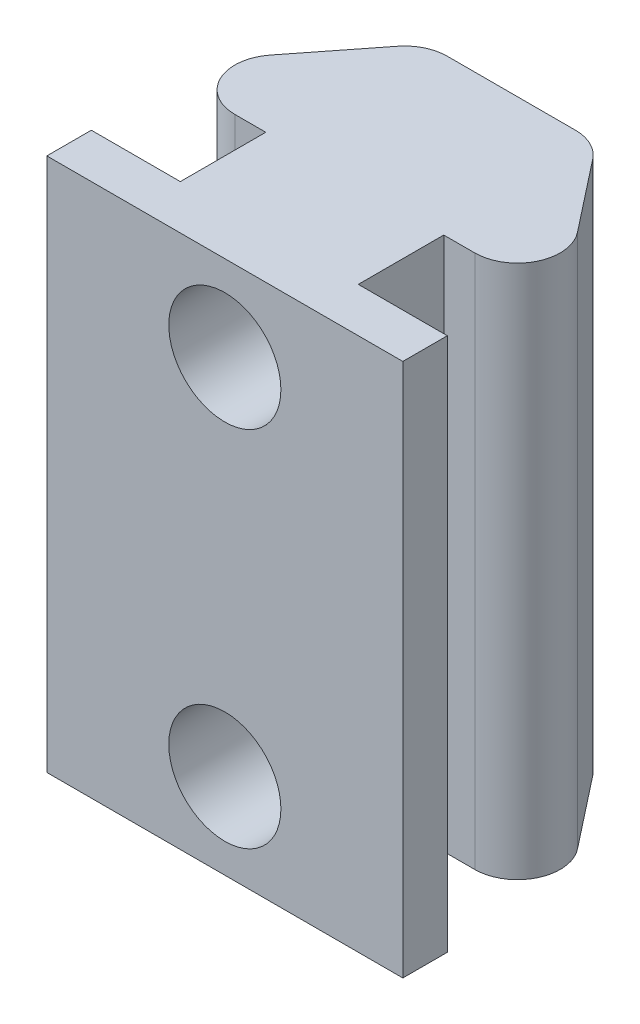
ISO-10303-21;
HEADER;
FILE_DESCRIPTION(('STEP AP214'),'2;1');
FILE_NAME('part.step','',(''),(''),'','','');
FILE_SCHEMA(('AUTOMOTIVE_DESIGN { 1 0 10303 214 1 1 1 1 }'));
ENDSEC;
DATA;
#1=APPLICATION_CONTEXT('core data for automotive mechanical design processes');
#2=APPLICATION_PROTOCOL_DEFINITION('international standard','automotive_design',2000,#1);
#3=PRODUCT_CONTEXT('',#1,'mechanical');
#4=PRODUCT('Part','Part','',(#3));
#5=PRODUCT_RELATED_PRODUCT_CATEGORY('part','',(#4));
#6=PRODUCT_DEFINITION_FORMATION('','',#4);
#7=PRODUCT_DEFINITION_CONTEXT('part definition',#1,'design');
#8=PRODUCT_DEFINITION('design','',#6,#7);
#9=PRODUCT_DEFINITION_SHAPE('','',#8);
#10=(LENGTH_UNIT() NAMED_UNIT(*) SI_UNIT(.MILLI.,.METRE.));
#11=(NAMED_UNIT(*) PLANE_ANGLE_UNIT() SI_UNIT($,.RADIAN.));
#12=(NAMED_UNIT(*) SI_UNIT($,.STERADIAN.) SOLID_ANGLE_UNIT());
#13=UNCERTAINTY_MEASURE_WITH_UNIT(LENGTH_MEASURE(1.E-05),#10,'distance_accuracy_value','');
#14=(GEOMETRIC_REPRESENTATION_CONTEXT(3) GLOBAL_UNCERTAINTY_ASSIGNED_CONTEXT((#13)) GLOBAL_UNIT_ASSIGNED_CONTEXT((#10,
#11,#12)) REPRESENTATION_CONTEXT('',''));
#15=CARTESIAN_POINT('',(0.,0.,0.));
#16=DIRECTION('',(0.,0.,1.));
#17=DIRECTION('',(1.,0.,0.));
#18=AXIS2_PLACEMENT_3D('',#15,#16,#17);
#19=CARTESIAN_POINT('',(0.,0.,0.));
#20=DIRECTION('',(0.,0.,1.));
#21=DIRECTION('',(1.,0.,0.));
#22=AXIS2_PLACEMENT_3D('',#19,#20,#21);
#23=PLANE('',#22);
#24=DIRECTION('',(0.,1.,0.));
#25=VECTOR('',#24,1.);
#26=CARTESIAN_POINT('',(-3.175,-23.995460961654,0.));
#27=LINE('',#26,#25);
#28=CARTESIAN_POINT('',(-3.175,-9.525,0.));
#29=VERTEX_POINT('',#28);
#30=CARTESIAN_POINT('',(-3.175,9.525,0.));
#31=VERTEX_POINT('',#30);
#32=EDGE_CURVE('E64',#29,#31,#27,.T.);
#33=ORIENTED_EDGE('',*,*,#32,.F.);
#34=DIRECTION('',(1.,0.,0.));
#35=VECTOR('',#34,1.);
#36=CARTESIAN_POINT('',(-6.35,-9.525,0.));
#37=LINE('',#36,#35);
#38=CARTESIAN_POINT('',(-6.35,-9.525,0.));
#39=VERTEX_POINT('',#38);
#40=EDGE_CURVE('E251',#39,#29,#37,.T.);
#41=ORIENTED_EDGE('',*,*,#40,.F.);
#42=DIRECTION('',(0.,1.,0.));
#43=VECTOR('',#42,1.);
#44=CARTESIAN_POINT('',(-6.35,-9.525,0.));
#45=LINE('',#44,#43);
#46=CARTESIAN_POINT('',(-6.35,9.525,0.));
#47=VERTEX_POINT('',#46);
#48=EDGE_CURVE('E239',#39,#47,#45,.T.);
#49=ORIENTED_EDGE('',*,*,#48,.T.);
#50=DIRECTION('',(1.,0.,0.));
#51=VECTOR('',#50,1.);
#52=CARTESIAN_POINT('',(-6.35,9.525,0.));
#53=LINE('',#52,#51);
#54=EDGE_CURVE('E246',#47,#31,#53,.T.);
#55=ORIENTED_EDGE('',*,*,#54,.T.);
#56=EDGE_LOOP('',(#33,#41,#49,#55));
#57=FACE_BOUND('',#56,.T.);
#58=ADVANCED_FACE('F39',(#57),#23,.F.);
#59=CARTESIAN_POINT('',(-6.35,9.525,1.5875));
#60=DIRECTION('',(0.,1.,0.));
#61=DIRECTION('',(0.,0.,1.));
#62=AXIS2_PLACEMENT_3D('',#59,#60,#61);
#63=PLANE('',#62);
#64=ORIENTED_EDGE('',*,*,#54,.F.);
#65=DIRECTION('',(0.,0.,-1.));
#66=VECTOR('',#65,1.);
#67=CARTESIAN_POINT('',(-6.35,9.525,1.5875));
#68=LINE('',#67,#66);
#69=CARTESIAN_POINT('',(-6.35,9.525,1.5875));
#70=VERTEX_POINT('',#69);
#71=EDGE_CURVE('E11',#70,#47,#68,.T.);
#72=ORIENTED_EDGE('',*,*,#71,.F.);
#73=DIRECTION('',(1.,0.,0.));
#74=VECTOR('',#73,1.);
#75=CARTESIAN_POINT('',(-6.35,9.525,1.5875));
#76=LINE('',#75,#74);
#77=CARTESIAN_POINT('',(6.35,9.525,1.5875));
#78=VERTEX_POINT('',#77);
#79=EDGE_CURVE('E235',#70,#78,#76,.T.);
#80=ORIENTED_EDGE('',*,*,#79,.T.);
#81=DIRECTION('',(0.,0.,-1.));
#82=VECTOR('',#81,1.);
#83=CARTESIAN_POINT('',(6.35,9.525,1.5875));
#84=LINE('',#83,#82);
#85=CARTESIAN_POINT('',(6.35,9.525,0.));
#86=VERTEX_POINT('',#85);
#87=EDGE_CURVE('E43',#78,#86,#84,.T.);
#88=ORIENTED_EDGE('',*,*,#87,.T.);
#89=CARTESIAN_POINT('',(3.175,9.525,0.));
#90=VERTEX_POINT('',#89);
#91=EDGE_CURVE('E179',#90,#86,#53,.T.);
#92=ORIENTED_EDGE('',*,*,#91,.F.);
#93=DIRECTION('',(0.,0.,-1.));
#94=VECTOR('',#93,1.);
#95=CARTESIAN_POINT('',(3.175,9.525,0.));
#96=LINE('',#95,#94);
#97=CARTESIAN_POINT('',(3.175,9.525,-3.048));
#98=VERTEX_POINT('',#97);
#99=EDGE_CURVE('E160',#90,#98,#96,.T.);
#100=ORIENTED_EDGE('',*,*,#99,.T.);
#101=DIRECTION('',(1.,0.,0.));
#102=VECTOR('',#101,1.);
#103=CARTESIAN_POINT('',(3.175,9.525,-3.048));
#104=LINE('',#103,#102);
#105=CARTESIAN_POINT('',(4.28146605456342,9.525,-3.048));
#106=VERTEX_POINT('',#105);
#107=EDGE_CURVE('E168',#98,#106,#104,.T.);
#108=ORIENTED_EDGE('',*,*,#107,.T.);
#109=CARTESIAN_POINT('',(4.28146605456342,9.525,-4.572));
#110=DIRECTION('',(0.,1.,0.));
#111=DIRECTION('',(0.,0.,1.));
#112=AXIS2_PLACEMENT_3D('',#109,#110,#111);
#113=CIRCLE('',#112,1.524);
#114=CARTESIAN_POINT('',(5.47987209756336,9.525,-5.51348762928742));
#115=VERTEX_POINT('',#114);
#116=EDGE_CURVE('E174',#106,#115,#113,.T.);
#117=ORIENTED_EDGE('',*,*,#116,.T.);
#118=DIRECTION('',(-0.617774034965497,0.,-0.786355671259799));
#119=VECTOR('',#118,1.);
#120=CARTESIAN_POINT('',(5.47987209756336,9.525,-5.51348762928742));
#121=LINE('',#120,#119);
#122=CARTESIAN_POINT('',(3.48440604299993,9.525,-8.05348762928742));
#123=VERTEX_POINT('',#122);
#124=EDGE_CURVE('E190',#115,#123,#121,.T.);
#125=ORIENTED_EDGE('',*,*,#124,.T.);
#126=CARTESIAN_POINT('',(2.286,9.525,-7.112));
#127=DIRECTION('',(0.,1.,0.));
#128=DIRECTION('',(0.,0.,1.));
#129=AXIS2_PLACEMENT_3D('',#126,#127,#128);
#130=CIRCLE('',#129,1.524);
#131=CARTESIAN_POINT('',(2.286,9.525,-8.636));
#132=VERTEX_POINT('',#131);
#133=EDGE_CURVE('E193',#123,#132,#130,.T.);
#134=ORIENTED_EDGE('',*,*,#133,.T.);
#135=DIRECTION('',(-1.,0.,0.));
#136=VECTOR('',#135,1.);
#137=CARTESIAN_POINT('',(2.286,9.525,-8.636));
#138=LINE('',#137,#136);
#139=CARTESIAN_POINT('',(-2.286,9.525,-8.636));
#140=VERTEX_POINT('',#139);
#141=EDGE_CURVE('E196',#132,#140,#138,.T.);
#142=ORIENTED_EDGE('',*,*,#141,.T.);
#143=CARTESIAN_POINT('',(-2.286,9.525,-7.112));
#144=DIRECTION('',(0.,1.,0.));
#145=DIRECTION('',(0.,0.,-1.));
#146=AXIS2_PLACEMENT_3D('',#143,#144,#145);
#147=CIRCLE('',#146,1.524);
#148=CARTESIAN_POINT('',(-3.48440604299993,9.525,-8.05348762928742));
#149=VERTEX_POINT('',#148);
#150=EDGE_CURVE('E199',#140,#149,#147,.T.);
#151=ORIENTED_EDGE('',*,*,#150,.T.);
#152=DIRECTION('',(-0.617774034965497,0.,0.786355671259799));
#153=VECTOR('',#152,1.);
#154=CARTESIAN_POINT('',(-5.47987209756336,9.525,-5.51348762928742));
#155=LINE('',#154,#153);
#156=CARTESIAN_POINT('',(-5.47987209756336,9.525,-5.51348762928742));
#157=VERTEX_POINT('',#156);
#158=EDGE_CURVE('E202',#149,#157,#155,.T.);
#159=ORIENTED_EDGE('',*,*,#158,.T.);
#160=CARTESIAN_POINT('',(-4.28146605456342,9.525,-4.572));
#161=DIRECTION('',(0.,1.,0.));
#162=DIRECTION('',(0.,0.,-1.));
#163=AXIS2_PLACEMENT_3D('',#160,#161,#162);
#164=CIRCLE('',#163,1.524);
#165=CARTESIAN_POINT('',(-4.28146605456342,9.525,-3.048));
#166=VERTEX_POINT('',#165);
#167=EDGE_CURVE('E205',#157,#166,#164,.T.);
#168=ORIENTED_EDGE('',*,*,#167,.T.);
#169=DIRECTION('',(1.,0.,0.));
#170=VECTOR('',#169,1.);
#171=CARTESIAN_POINT('',(-3.175,9.525,-3.048));
#172=LINE('',#171,#170);
#173=CARTESIAN_POINT('',(-3.175,9.525,-3.048));
#174=VERTEX_POINT('',#173);
#175=EDGE_CURVE('E208',#166,#174,#172,.T.);
#176=ORIENTED_EDGE('',*,*,#175,.T.);
#177=DIRECTION('',(0.,0.,1.));
#178=VECTOR('',#177,1.);
#179=CARTESIAN_POINT('',(-3.175,9.525,0.));
#180=LINE('',#179,#178);
#181=EDGE_CURVE('E211',#174,#31,#180,.T.);
#182=ORIENTED_EDGE('',*,*,#181,.T.);
#183=EDGE_LOOP('',(#64,#72,#80,#88,#92,#100,#108,#117,#125,#134,#142,#151,#159,#168,#176,#182));
#184=FACE_BOUND('',#183,.T.);
#185=ADVANCED_FACE('F41',(#184),#63,.T.);
#186=CARTESIAN_POINT('',(-6.35,-9.525,1.5875));
#187=DIRECTION('',(-1.,0.,0.));
#188=DIRECTION('',(0.,0.,1.));
#189=AXIS2_PLACEMENT_3D('',#186,#187,#188);
#190=PLANE('',#189);
#191=ORIENTED_EDGE('',*,*,#48,.F.);
#192=DIRECTION('',(0.,0.,-1.));
#193=VECTOR('',#192,1.);
#194=CARTESIAN_POINT('',(-6.35,-9.525,1.5875));
#195=LINE('',#194,#193);
#196=CARTESIAN_POINT('',(-6.35,-9.525,1.5875));
#197=VERTEX_POINT('',#196);
#198=EDGE_CURVE('E48',#197,#39,#195,.T.);
#199=ORIENTED_EDGE('',*,*,#198,.F.);
#200=DIRECTION('',(0.,1.,0.));
#201=VECTOR('',#200,1.);
#202=CARTESIAN_POINT('',(-6.35,-9.525,1.5875));
#203=LINE('',#202,#201);
#204=EDGE_CURVE('E243',#197,#70,#203,.T.);
#205=ORIENTED_EDGE('',*,*,#204,.T.);
#206=ORIENTED_EDGE('',*,*,#71,.T.);
#207=EDGE_LOOP('',(#191,#199,#205,#206));
#208=FACE_BOUND('',#207,.T.);
#209=ADVANCED_FACE('F284',(#208),#190,.T.);
#210=CARTESIAN_POINT('',(-6.35,-9.525,1.5875));
#211=DIRECTION('',(0.,1.,0.));
#212=DIRECTION('',(0.,0.,1.));
#213=AXIS2_PLACEMENT_3D('',#210,#211,#212);
#214=PLANE('',#213);
#215=ORIENTED_EDGE('',*,*,#40,.T.);
#216=DIRECTION('',(0.,0.,-1.));
#217=VECTOR('',#216,1.);
#218=CARTESIAN_POINT('',(-3.175,-9.525,0.));
#219=LINE('',#218,#217);
#220=CARTESIAN_POINT('',(-3.175,-9.525,-3.048));
#221=VERTEX_POINT('',#220);
#222=EDGE_CURVE('E186',#29,#221,#219,.T.);
#223=ORIENTED_EDGE('',*,*,#222,.T.);
#224=DIRECTION('',(-1.,0.,0.));
#225=VECTOR('',#224,1.);
#226=CARTESIAN_POINT('',(-3.175,-9.525,-3.048));
#227=LINE('',#226,#225);
#228=CARTESIAN_POINT('',(-4.28146605456342,-9.525,-3.048));
#229=VERTEX_POINT('',#228);
#230=EDGE_CURVE('E496',#221,#229,#227,.T.);
#231=ORIENTED_EDGE('',*,*,#230,.T.);
#232=CARTESIAN_POINT('',(-4.28146605456342,-9.525,-4.572));
#233=DIRECTION('',(0.,1.,0.));
#234=DIRECTION('',(0.,0.,1.));
#235=AXIS2_PLACEMENT_3D('',#232,#233,#234);
#236=CIRCLE('',#235,1.524);
#237=CARTESIAN_POINT('',(-5.47987209756336,-9.525,-5.51348762928742));
#238=VERTEX_POINT('',#237);
#239=EDGE_CURVE('E495',#229,#238,#236,.F.);
#240=ORIENTED_EDGE('',*,*,#239,.T.);
#241=DIRECTION('',(0.617774034965497,0.,-0.786355671259799));
#242=VECTOR('',#241,1.);
#243=CARTESIAN_POINT('',(-5.47987209756336,-9.525,-5.51348762928742));
#244=LINE('',#243,#242);
#245=CARTESIAN_POINT('',(-3.48440604299993,-9.525,-8.05348762928742));
#246=VERTEX_POINT('',#245);
#247=EDGE_CURVE('E493',#238,#246,#244,.T.);
#248=ORIENTED_EDGE('',*,*,#247,.T.);
#249=CARTESIAN_POINT('',(-2.286,-9.525,-7.112));
#250=DIRECTION('',(0.,1.,0.));
#251=DIRECTION('',(0.,0.,1.));
#252=AXIS2_PLACEMENT_3D('',#249,#250,#251);
#253=CIRCLE('',#252,1.524);
#254=CARTESIAN_POINT('',(-2.286,-9.525,-8.636));
#255=VERTEX_POINT('',#254);
#256=EDGE_CURVE('E491',#246,#255,#253,.F.);
#257=ORIENTED_EDGE('',*,*,#256,.T.);
#258=DIRECTION('',(1.,0.,0.));
#259=VECTOR('',#258,1.);
#260=CARTESIAN_POINT('',(2.286,-9.525,-8.636));
#261=LINE('',#260,#259);
#262=CARTESIAN_POINT('',(2.286,-9.525,-8.636));
#263=VERTEX_POINT('',#262);
#264=EDGE_CURVE('E489',#255,#263,#261,.T.);
#265=ORIENTED_EDGE('',*,*,#264,.T.);
#266=CARTESIAN_POINT('',(2.286,-9.525,-7.112));
#267=DIRECTION('',(0.,1.,0.));
#268=DIRECTION('',(0.,0.,1.));
#269=AXIS2_PLACEMENT_3D('',#266,#267,#268);
#270=CIRCLE('',#269,1.524);
#271=CARTESIAN_POINT('',(3.48440604299993,-9.525,-8.05348762928742));
#272=VERTEX_POINT('',#271);
#273=EDGE_CURVE('E487',#263,#272,#270,.F.);
#274=ORIENTED_EDGE('',*,*,#273,.T.);
#275=DIRECTION('',(0.617774034965497,0.,0.786355671259799));
#276=VECTOR('',#275,1.);
#277=CARTESIAN_POINT('',(5.47987209756336,-9.525,-5.51348762928742));
#278=LINE('',#277,#276);
#279=CARTESIAN_POINT('',(5.47987209756336,-9.525,-5.51348762928742));
#280=VERTEX_POINT('',#279);
#281=EDGE_CURVE('E485',#272,#280,#278,.T.);
#282=ORIENTED_EDGE('',*,*,#281,.T.);
#283=CARTESIAN_POINT('',(4.28146605456342,-9.525,-4.572));
#284=DIRECTION('',(0.,1.,0.));
#285=DIRECTION('',(0.,0.,1.));
#286=AXIS2_PLACEMENT_3D('',#283,#284,#285);
#287=CIRCLE('',#286,1.524);
#288=CARTESIAN_POINT('',(4.28146605456342,-9.525,-3.048));
#289=VERTEX_POINT('',#288);
#290=EDGE_CURVE('E483',#280,#289,#287,.F.);
#291=ORIENTED_EDGE('',*,*,#290,.T.);
#292=DIRECTION('',(-1.,0.,0.));
#293=VECTOR('',#292,1.);
#294=CARTESIAN_POINT('',(3.175,-9.525,-3.048));
#295=LINE('',#294,#293);
#296=CARTESIAN_POINT('',(3.175,-9.525,-3.048));
#297=VERTEX_POINT('',#296);
#298=EDGE_CURVE('E215',#289,#297,#295,.T.);
#299=ORIENTED_EDGE('',*,*,#298,.T.);
#300=DIRECTION('',(0.,0.,1.));
#301=VECTOR('',#300,1.);
#302=CARTESIAN_POINT('',(3.175,-9.525,0.));
#303=LINE('',#302,#301);
#304=CARTESIAN_POINT('',(3.175,-9.525,0.));
#305=VERTEX_POINT('',#304);
#306=EDGE_CURVE('E161',#297,#305,#303,.T.);
#307=ORIENTED_EDGE('',*,*,#306,.T.);
#308=CARTESIAN_POINT('',(6.35,-9.525,0.));
#309=VERTEX_POINT('',#308);
#310=EDGE_CURVE('E56',#305,#309,#37,.T.);
#311=ORIENTED_EDGE('',*,*,#310,.T.);
#312=DIRECTION('',(0.,0.,-1.));
#313=VECTOR('',#312,1.);
#314=CARTESIAN_POINT('',(6.35,-9.525,1.5875));
#315=LINE('',#314,#313);
#316=CARTESIAN_POINT('',(6.35,-9.525,1.5875));
#317=VERTEX_POINT('',#316);
#318=EDGE_CURVE('E255',#317,#309,#315,.T.);
#319=ORIENTED_EDGE('',*,*,#318,.F.);
#320=DIRECTION('',(1.,0.,0.));
#321=VECTOR('',#320,1.);
#322=CARTESIAN_POINT('',(-6.35,-9.525,1.5875));
#323=LINE('',#322,#321);
#324=EDGE_CURVE('E241',#197,#317,#323,.T.);
#325=ORIENTED_EDGE('',*,*,#324,.F.);
#326=ORIENTED_EDGE('',*,*,#198,.T.);
#327=EDGE_LOOP('',(#215,#223,#231,#240,#248,#257,#265,#274,#282,#291,#299,#307,#311,#319,#325,#326));
#328=FACE_BOUND('',#327,.T.);
#329=ADVANCED_FACE('F288',(#328),#214,.F.);
#330=CARTESIAN_POINT('',(6.35,-9.525,1.5875));
#331=DIRECTION('',(-1.,0.,0.));
#332=DIRECTION('',(0.,0.,1.));
#333=AXIS2_PLACEMENT_3D('',#330,#331,#332);
#334=PLANE('',#333);
#335=DIRECTION('',(0.,1.,0.));
#336=VECTOR('',#335,1.);
#337=CARTESIAN_POINT('',(6.35,-9.525,0.));
#338=LINE('',#337,#336);
#339=EDGE_CURVE('E248',#309,#86,#338,.T.);
#340=ORIENTED_EDGE('',*,*,#339,.T.);
#341=ORIENTED_EDGE('',*,*,#87,.F.);
#342=DIRECTION('',(0.,1.,0.));
#343=VECTOR('',#342,1.);
#344=CARTESIAN_POINT('',(6.35,-9.525,1.5875));
#345=LINE('',#344,#343);
#346=EDGE_CURVE('E238',#317,#78,#345,.T.);
#347=ORIENTED_EDGE('',*,*,#346,.F.);
#348=ORIENTED_EDGE('',*,*,#318,.T.);
#349=EDGE_LOOP('',(#340,#341,#347,#348));
#350=FACE_BOUND('',#349,.T.);
#351=ADVANCED_FACE('F262',(#350),#334,.F.);
#352=CARTESIAN_POINT('',(0.,0.,1.5875));
#353=DIRECTION('',(0.,0.,1.));
#354=DIRECTION('',(1.,0.,0.));
#355=AXIS2_PLACEMENT_3D('',#352,#353,#354);
#356=PLANE('',#355);
#357=CARTESIAN_POINT('',(0.,6.477,1.5875));
#358=DIRECTION('',(0.,0.,1.));
#359=DIRECTION('',(1.,0.,0.));
#360=AXIS2_PLACEMENT_3D('',#357,#358,#359);
#361=CIRCLE('',#360,2.);
#362=CARTESIAN_POINT('',(2.,6.477,1.5875));
#363=VERTEX_POINT('',#362);
#364=EDGE_CURVE('E183',#363,#363,#361,.T.);
#365=ORIENTED_EDGE('',*,*,#364,.F.);
#366=EDGE_LOOP('',(#365));
#367=FACE_BOUND('',#366,.T.);
#368=CARTESIAN_POINT('',(0.,-6.477,1.5875));
#369=DIRECTION('',(0.,0.,1.));
#370=DIRECTION('',(-1.,0.,0.));
#371=AXIS2_PLACEMENT_3D('',#368,#369,#370);
#372=CIRCLE('',#371,2.);
#373=CARTESIAN_POINT('',(-2.,-6.477,1.5875));
#374=VERTEX_POINT('',#373);
#375=EDGE_CURVE('E474',#374,#374,#372,.T.);
#376=ORIENTED_EDGE('',*,*,#375,.F.);
#377=EDGE_LOOP('',(#376));
#378=FACE_BOUND('',#377,.T.);
#379=ORIENTED_EDGE('',*,*,#79,.F.);
#380=ORIENTED_EDGE('',*,*,#204,.F.);
#381=ORIENTED_EDGE('',*,*,#324,.T.);
#382=ORIENTED_EDGE('',*,*,#346,.T.);
#383=EDGE_LOOP('',(#379,#380,#381,#382));
#384=FACE_BOUND('',#383,.T.);
#385=ADVANCED_FACE('F266',(#367,#378,#384),#356,.T.);
#386=ORIENTED_EDGE('',*,*,#310,.F.);
#387=DIRECTION('',(0.,1.,0.));
#388=VECTOR('',#387,1.);
#389=CARTESIAN_POINT('',(3.175,-23.995460961654,0.));
#390=LINE('',#389,#388);
#391=EDGE_CURVE('E165',#305,#90,#390,.T.);
#392=ORIENTED_EDGE('',*,*,#391,.T.);
#393=ORIENTED_EDGE('',*,*,#91,.T.);
#394=ORIENTED_EDGE('',*,*,#339,.F.);
#395=EDGE_LOOP('',(#386,#392,#393,#394));
#396=FACE_BOUND('',#395,.T.);
#397=ADVANCED_FACE('F263',(#396),#23,.F.);
#398=CARTESIAN_POINT('',(-3.175,-23.995460961654,0.));
#399=DIRECTION('',(-1.,0.,0.));
#400=DIRECTION('',(0.,0.,1.));
#401=AXIS2_PLACEMENT_3D('',#398,#399,#400);
#402=PLANE('',#401);
#403=ORIENTED_EDGE('',*,*,#222,.F.);
#404=ORIENTED_EDGE('',*,*,#32,.T.);
#405=ORIENTED_EDGE('',*,*,#181,.F.);
#406=DIRECTION('',(0.,1.,0.));
#407=VECTOR('',#406,1.);
#408=CARTESIAN_POINT('',(-3.175,-23.995460961654,-3.048));
#409=LINE('',#408,#407);
#410=EDGE_CURVE('E216',#221,#174,#409,.T.);
#411=ORIENTED_EDGE('',*,*,#410,.F.);
#412=EDGE_LOOP('',(#403,#404,#405,#411));
#413=FACE_BOUND('',#412,.T.);
#414=ADVANCED_FACE('F265',(#413),#402,.T.);
#415=CARTESIAN_POINT('',(-3.175,-23.995460961654,-3.048));
#416=DIRECTION('',(0.,0.,1.));
#417=DIRECTION('',(1.,0.,0.));
#418=AXIS2_PLACEMENT_3D('',#415,#416,#417);
#419=PLANE('',#418);
#420=ORIENTED_EDGE('',*,*,#230,.F.);
#421=ORIENTED_EDGE('',*,*,#410,.T.);
#422=ORIENTED_EDGE('',*,*,#175,.F.);
#423=DIRECTION('',(0.,1.,0.));
#424=VECTOR('',#423,1.);
#425=CARTESIAN_POINT('',(-4.28146605456342,-23.995460961654,-3.048));
#426=LINE('',#425,#424);
#427=EDGE_CURVE('E218',#229,#166,#426,.T.);
#428=ORIENTED_EDGE('',*,*,#427,.F.);
#429=EDGE_LOOP('',(#420,#421,#422,#428));
#430=FACE_BOUND('',#429,.T.);
#431=ADVANCED_FACE('F272',(#430),#419,.T.);
#432=CARTESIAN_POINT('',(-4.28146605456342,-23.995460961654,-4.572));
#433=DIRECTION('',(0.,1.,0.));
#434=DIRECTION('',(0.,0.,1.));
#435=AXIS2_PLACEMENT_3D('',#432,#433,#434);
#436=CYLINDRICAL_SURFACE('',#435,1.524);
#437=ORIENTED_EDGE('',*,*,#239,.F.);
#438=ORIENTED_EDGE('',*,*,#427,.T.);
#439=ORIENTED_EDGE('',*,*,#167,.F.);
#440=DIRECTION('',(0.,1.,0.));
#441=VECTOR('',#440,1.);
#442=CARTESIAN_POINT('',(-5.47987209756336,-23.995460961654,-5.51348762928742));
#443=LINE('',#442,#441);
#444=EDGE_CURVE('E220',#238,#157,#443,.T.);
#445=ORIENTED_EDGE('',*,*,#444,.F.);
#446=EDGE_LOOP('',(#437,#438,#439,#445));
#447=FACE_BOUND('',#446,.T.);
#448=ADVANCED_FACE('F343',(#447),#436,.T.);
#449=CARTESIAN_POINT('',(-5.47987209756336,-23.995460961654,-5.51348762928742));
#450=DIRECTION('',(-0.786355671259799,0.,-0.617774034965497));
#451=DIRECTION('',(-0.617774034965497,0.,0.786355671259799));
#452=AXIS2_PLACEMENT_3D('',#449,#450,#451);
#453=PLANE('',#452);
#454=ORIENTED_EDGE('',*,*,#247,.F.);
#455=ORIENTED_EDGE('',*,*,#444,.T.);
#456=ORIENTED_EDGE('',*,*,#158,.F.);
#457=DIRECTION('',(0.,1.,0.));
#458=VECTOR('',#457,1.);
#459=CARTESIAN_POINT('',(-3.48440604299993,-23.995460961654,-8.05348762928742));
#460=LINE('',#459,#458);
#461=EDGE_CURVE('E222',#246,#149,#460,.T.);
#462=ORIENTED_EDGE('',*,*,#461,.F.);
#463=EDGE_LOOP('',(#454,#455,#456,#462));
#464=FACE_BOUND('',#463,.T.);
#465=ADVANCED_FACE('F353',(#464),#453,.T.);
#466=CARTESIAN_POINT('',(-2.286,-23.995460961654,-7.112));
#467=DIRECTION('',(0.,1.,0.));
#468=DIRECTION('',(0.,0.,1.));
#469=AXIS2_PLACEMENT_3D('',#466,#467,#468);
#470=CYLINDRICAL_SURFACE('',#469,1.524);
#471=ORIENTED_EDGE('',*,*,#256,.F.);
#472=ORIENTED_EDGE('',*,*,#461,.T.);
#473=ORIENTED_EDGE('',*,*,#150,.F.);
#474=DIRECTION('',(0.,1.,0.));
#475=VECTOR('',#474,1.);
#476=CARTESIAN_POINT('',(-2.286,-23.995460961654,-8.636));
#477=LINE('',#476,#475);
#478=EDGE_CURVE('E224',#255,#140,#477,.T.);
#479=ORIENTED_EDGE('',*,*,#478,.F.);
#480=EDGE_LOOP('',(#471,#472,#473,#479));
#481=FACE_BOUND('',#480,.T.);
#482=ADVANCED_FACE('F363',(#481),#470,.T.);
#483=CARTESIAN_POINT('',(2.286,-23.995460961654,-8.636));
#484=DIRECTION('',(0.,0.,-1.));
#485=DIRECTION('',(-1.,0.,0.));
#486=AXIS2_PLACEMENT_3D('',#483,#484,#485);
#487=PLANE('',#486);
#488=ORIENTED_EDGE('',*,*,#264,.F.);
#489=ORIENTED_EDGE('',*,*,#478,.T.);
#490=ORIENTED_EDGE('',*,*,#141,.F.);
#491=DIRECTION('',(0.,1.,0.));
#492=VECTOR('',#491,1.);
#493=CARTESIAN_POINT('',(2.286,-23.995460961654,-8.636));
#494=LINE('',#493,#492);
#495=EDGE_CURVE('E226',#263,#132,#494,.T.);
#496=ORIENTED_EDGE('',*,*,#495,.F.);
#497=EDGE_LOOP('',(#488,#489,#490,#496));
#498=FACE_BOUND('',#497,.T.);
#499=ADVANCED_FACE('F373',(#498),#487,.T.);
#500=CARTESIAN_POINT('',(2.286,-23.995460961654,-7.112));
#501=DIRECTION('',(0.,1.,0.));
#502=DIRECTION('',(0.,0.,1.));
#503=AXIS2_PLACEMENT_3D('',#500,#501,#502);
#504=CYLINDRICAL_SURFACE('',#503,1.524);
#505=ORIENTED_EDGE('',*,*,#273,.F.);
#506=ORIENTED_EDGE('',*,*,#495,.T.);
#507=ORIENTED_EDGE('',*,*,#133,.F.);
#508=DIRECTION('',(0.,1.,0.));
#509=VECTOR('',#508,1.);
#510=CARTESIAN_POINT('',(3.48440604299993,-23.995460961654,-8.05348762928742));
#511=LINE('',#510,#509);
#512=EDGE_CURVE('E228',#272,#123,#511,.T.);
#513=ORIENTED_EDGE('',*,*,#512,.F.);
#514=EDGE_LOOP('',(#505,#506,#507,#513));
#515=FACE_BOUND('',#514,.T.);
#516=ADVANCED_FACE('F383',(#515),#504,.T.);
#517=CARTESIAN_POINT('',(5.47987209756336,-23.995460961654,-5.51348762928742));
#518=DIRECTION('',(0.786355671259799,0.,-0.617774034965497));
#519=DIRECTION('',(-0.617774034965497,0.,-0.786355671259799));
#520=AXIS2_PLACEMENT_3D('',#517,#518,#519);
#521=PLANE('',#520);
#522=ORIENTED_EDGE('',*,*,#281,.F.);
#523=ORIENTED_EDGE('',*,*,#512,.T.);
#524=ORIENTED_EDGE('',*,*,#124,.F.);
#525=DIRECTION('',(0.,1.,0.));
#526=VECTOR('',#525,1.);
#527=CARTESIAN_POINT('',(5.47987209756336,-23.995460961654,-5.51348762928742));
#528=LINE('',#527,#526);
#529=EDGE_CURVE('E230',#280,#115,#528,.T.);
#530=ORIENTED_EDGE('',*,*,#529,.F.);
#531=EDGE_LOOP('',(#522,#523,#524,#530));
#532=FACE_BOUND('',#531,.T.);
#533=ADVANCED_FACE('F393',(#532),#521,.T.);
#534=CARTESIAN_POINT('',(4.28146605456342,-23.995460961654,-4.572));
#535=DIRECTION('',(0.,1.,0.));
#536=DIRECTION('',(0.,0.,1.));
#537=AXIS2_PLACEMENT_3D('',#534,#535,#536);
#538=CYLINDRICAL_SURFACE('',#537,1.524);
#539=ORIENTED_EDGE('',*,*,#290,.F.);
#540=ORIENTED_EDGE('',*,*,#529,.T.);
#541=ORIENTED_EDGE('',*,*,#116,.F.);
#542=DIRECTION('',(0.,1.,0.));
#543=VECTOR('',#542,1.);
#544=CARTESIAN_POINT('',(4.28146605456342,-23.995460961654,-3.048));
#545=LINE('',#544,#543);
#546=EDGE_CURVE('E164',#289,#106,#545,.T.);
#547=ORIENTED_EDGE('',*,*,#546,.F.);
#548=EDGE_LOOP('',(#539,#540,#541,#547));
#549=FACE_BOUND('',#548,.T.);
#550=ADVANCED_FACE('F403',(#549),#538,.T.);
#551=CARTESIAN_POINT('',(3.175,-23.995460961654,-3.048));
#552=DIRECTION('',(0.,0.,1.));
#553=DIRECTION('',(1.,0.,0.));
#554=AXIS2_PLACEMENT_3D('',#551,#552,#553);
#555=PLANE('',#554);
#556=ORIENTED_EDGE('',*,*,#298,.F.);
#557=ORIENTED_EDGE('',*,*,#546,.T.);
#558=ORIENTED_EDGE('',*,*,#107,.F.);
#559=DIRECTION('',(0.,1.,0.));
#560=VECTOR('',#559,1.);
#561=CARTESIAN_POINT('',(3.175,-23.995460961654,-3.048));
#562=LINE('',#561,#560);
#563=EDGE_CURVE('E155',#297,#98,#562,.T.);
#564=ORIENTED_EDGE('',*,*,#563,.F.);
#565=EDGE_LOOP('',(#556,#557,#558,#564));
#566=FACE_BOUND('',#565,.T.);
#567=ADVANCED_FACE('F169',(#566),#555,.T.);
#568=CARTESIAN_POINT('',(3.175,-23.995460961654,0.));
#569=DIRECTION('',(1.,0.,0.));
#570=DIRECTION('',(0.,0.,-1.));
#571=AXIS2_PLACEMENT_3D('',#568,#569,#570);
#572=PLANE('',#571);
#573=ORIENTED_EDGE('',*,*,#306,.F.);
#574=ORIENTED_EDGE('',*,*,#563,.T.);
#575=ORIENTED_EDGE('',*,*,#99,.F.);
#576=ORIENTED_EDGE('',*,*,#391,.F.);
#577=EDGE_LOOP('',(#573,#574,#575,#576));
#578=FACE_BOUND('',#577,.T.);
#579=ADVANCED_FACE('F157',(#578),#572,.T.);
#580=CARTESIAN_POINT('',(0.,-6.477,-8.70485424949238));
#581=DIRECTION('',(0.,0.,1.));
#582=DIRECTION('',(1.,0.,0.));
#583=AXIS2_PLACEMENT_3D('',#580,#581,#582);
#584=CYLINDRICAL_SURFACE('',#583,2.);
#585=CARTESIAN_POINT('',(0.,-6.477,-3.048));
#586=DIRECTION('',(0.,0.,1.));
#587=DIRECTION('',(1.,0.,0.));
#588=AXIS2_PLACEMENT_3D('',#585,#586,#587);
#589=CIRCLE('',#588,2.);
#590=CARTESIAN_POINT('',(2.,-6.477,-3.048));
#591=VERTEX_POINT('',#590);
#592=EDGE_CURVE('E477',#591,#591,#589,.F.);
#593=ORIENTED_EDGE('',*,*,#592,.T.);
#594=EDGE_LOOP('',(#593));
#595=FACE_BOUND('',#594,.T.);
#596=ORIENTED_EDGE('',*,*,#375,.T.);
#597=EDGE_LOOP('',(#596));
#598=FACE_BOUND('',#597,.T.);
#599=ADVANCED_FACE('F429',(#595,#598),#584,.F.);
#600=CARTESIAN_POINT('',(3.175,-23.995460961654,-3.048));
#601=DIRECTION('',(0.,0.,1.));
#602=DIRECTION('',(1.,0.,0.));
#603=AXIS2_PLACEMENT_3D('',#600,#601,#602);
#604=PLANE('',#603);
#605=ORIENTED_EDGE('',*,*,#592,.F.);
#606=EDGE_LOOP('',(#605));
#607=FACE_BOUND('',#606,.T.);
#608=ADVANCED_FACE('F437',(#607),#604,.T.);
#609=CARTESIAN_POINT('',(0.,6.477,-8.70485424949238));
#610=DIRECTION('',(0.,0.,1.));
#611=DIRECTION('',(1.,0.,0.));
#612=AXIS2_PLACEMENT_3D('',#609,#610,#611);
#613=CYLINDRICAL_SURFACE('',#612,2.);
#614=CARTESIAN_POINT('',(0.,6.477,-3.048));
#615=DIRECTION('',(0.,0.,1.));
#616=DIRECTION('',(1.,0.,0.));
#617=AXIS2_PLACEMENT_3D('',#614,#615,#616);
#618=CIRCLE('',#617,2.);
#619=CARTESIAN_POINT('',(2.,6.477,-3.048));
#620=VERTEX_POINT('',#619);
#621=EDGE_CURVE('E180',#620,#620,#618,.F.);
#622=ORIENTED_EDGE('',*,*,#621,.T.);
#623=EDGE_LOOP('',(#622));
#624=FACE_BOUND('',#623,.T.);
#625=ORIENTED_EDGE('',*,*,#364,.T.);
#626=EDGE_LOOP('',(#625));
#627=FACE_BOUND('',#626,.T.);
#628=ADVANCED_FACE('F447',(#624,#627),#613,.F.);
#629=CARTESIAN_POINT('',(3.175,-23.995460961654,-3.048));
#630=DIRECTION('',(0.,0.,1.));
#631=DIRECTION('',(1.,0.,0.));
#632=AXIS2_PLACEMENT_3D('',#629,#630,#631);
#633=PLANE('',#632);
#634=ORIENTED_EDGE('',*,*,#621,.F.);
#635=EDGE_LOOP('',(#634));
#636=FACE_BOUND('',#635,.T.);
#637=ADVANCED_FACE('F457',(#636),#633,.T.);
#638=CLOSED_SHELL('',(#58,#185,#209,#329,#351,#385,#397,#414,#431,#448,#465,#482,#499,#516,#533,
#550,#567,#579,#599,#608,#628,#637));
#639=MANIFOLD_SOLID_BREP('B2',#638);
#640=ADVANCED_BREP_SHAPE_REPRESENTATION('',(#18,#639),#14);
#641=SHAPE_DEFINITION_REPRESENTATION(#9,#640);
ENDSEC;
END-ISO-10303-21;
